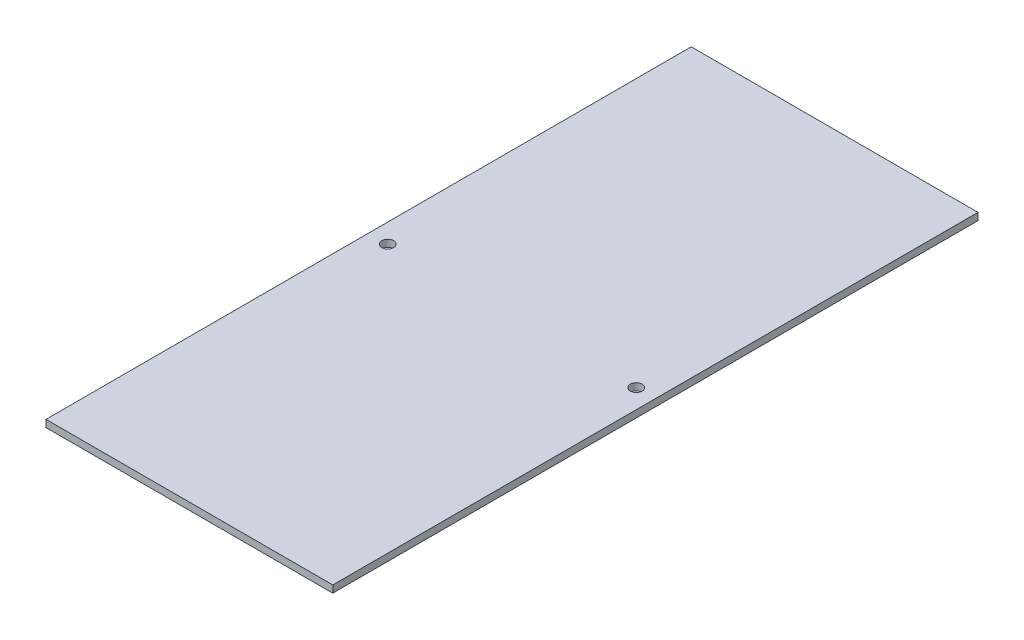
ISO-10303-21;
HEADER;
FILE_DESCRIPTION(('STEP AP214'),'2;1');
FILE_NAME('part.step','',(''),(''),'','','');
FILE_SCHEMA(('AUTOMOTIVE_DESIGN { 1 0 10303 214 1 1 1 1 }'));
ENDSEC;
DATA;
#1=APPLICATION_CONTEXT('core data for automotive mechanical design processes');
#2=APPLICATION_PROTOCOL_DEFINITION('international standard','automotive_design',2000,#1);
#3=PRODUCT_CONTEXT('',#1,'mechanical');
#4=PRODUCT('Part','Part','',(#3));
#5=PRODUCT_RELATED_PRODUCT_CATEGORY('part','',(#4));
#6=PRODUCT_DEFINITION_FORMATION('','',#4);
#7=PRODUCT_DEFINITION_CONTEXT('part definition',#1,'design');
#8=PRODUCT_DEFINITION('design','',#6,#7);
#9=PRODUCT_DEFINITION_SHAPE('','',#8);
#10=(LENGTH_UNIT() NAMED_UNIT(*) SI_UNIT(.MILLI.,.METRE.));
#11=(NAMED_UNIT(*) PLANE_ANGLE_UNIT() SI_UNIT($,.RADIAN.));
#12=(NAMED_UNIT(*) SI_UNIT($,.STERADIAN.) SOLID_ANGLE_UNIT());
#13=UNCERTAINTY_MEASURE_WITH_UNIT(LENGTH_MEASURE(1.E-05),#10,'distance_accuracy_value','');
#14=(GEOMETRIC_REPRESENTATION_CONTEXT(3) GLOBAL_UNCERTAINTY_ASSIGNED_CONTEXT((#13)) GLOBAL_UNIT_ASSIGNED_CONTEXT((#10,
#11,#12)) REPRESENTATION_CONTEXT('',''));
#15=CARTESIAN_POINT('',(0.,0.,0.));
#16=DIRECTION('',(0.,0.,1.));
#17=DIRECTION('',(1.,0.,0.));
#18=AXIS2_PLACEMENT_3D('',#15,#16,#17);
#19=CARTESIAN_POINT('',(60.,-3.,135.));
#20=DIRECTION('',(1.,0.,0.));
#21=DIRECTION('',(0.,0.,-1.));
#22=AXIS2_PLACEMENT_3D('',#19,#20,#21);
#23=PLANE('',#22);
#24=DIRECTION('',(0.,0.,-1.));
#25=VECTOR('',#24,1.);
#26=CARTESIAN_POINT('',(60.,0.,135.));
#27=LINE('',#26,#25);
#28=CARTESIAN_POINT('',(60.,0.,135.));
#29=VERTEX_POINT('',#28);
#30=CARTESIAN_POINT('',(60.,0.,-135.));
#31=VERTEX_POINT('',#30);
#32=EDGE_CURVE('E100',#29,#31,#27,.T.);
#33=ORIENTED_EDGE('',*,*,#32,.F.);
#34=DIRECTION('',(0.,1.,0.));
#35=VECTOR('',#34,1.);
#36=CARTESIAN_POINT('',(60.,-3.,135.));
#37=LINE('',#36,#35);
#38=CARTESIAN_POINT('',(60.,-3.,135.));
#39=VERTEX_POINT('',#38);
#40=EDGE_CURVE('E11',#39,#29,#37,.T.);
#41=ORIENTED_EDGE('',*,*,#40,.F.);
#42=DIRECTION('',(0.,0.,-1.));
#43=VECTOR('',#42,1.);
#44=CARTESIAN_POINT('',(60.,-3.,135.));
#45=LINE('',#44,#43);
#46=CARTESIAN_POINT('',(60.,-3.,-135.));
#47=VERTEX_POINT('',#46);
#48=EDGE_CURVE('E93',#39,#47,#45,.T.);
#49=ORIENTED_EDGE('',*,*,#48,.T.);
#50=DIRECTION('',(0.,1.,0.));
#51=VECTOR('',#50,1.);
#52=CARTESIAN_POINT('',(60.,-3.,-135.));
#53=LINE('',#52,#51);
#54=EDGE_CURVE('E38',#47,#31,#53,.T.);
#55=ORIENTED_EDGE('',*,*,#54,.T.);
#56=EDGE_LOOP('',(#33,#41,#49,#55));
#57=FACE_BOUND('',#56,.T.);
#58=ADVANCED_FACE('F35',(#57),#23,.T.);
#59=CARTESIAN_POINT('',(-60.,-3.,135.));
#60=DIRECTION('',(0.,0.,1.));
#61=DIRECTION('',(1.,0.,0.));
#62=AXIS2_PLACEMENT_3D('',#59,#60,#61);
#63=PLANE('',#62);
#64=DIRECTION('',(1.,0.,0.));
#65=VECTOR('',#64,1.);
#66=CARTESIAN_POINT('',(-60.,0.,135.));
#67=LINE('',#66,#65);
#68=CARTESIAN_POINT('',(-60.,0.,135.));
#69=VERTEX_POINT('',#68);
#70=EDGE_CURVE('E95',#69,#29,#67,.T.);
#71=ORIENTED_EDGE('',*,*,#70,.F.);
#72=DIRECTION('',(0.,1.,0.));
#73=VECTOR('',#72,1.);
#74=CARTESIAN_POINT('',(-60.,-3.,135.));
#75=LINE('',#74,#73);
#76=CARTESIAN_POINT('',(-60.,-3.,135.));
#77=VERTEX_POINT('',#76);
#78=EDGE_CURVE('E44',#77,#69,#75,.T.);
#79=ORIENTED_EDGE('',*,*,#78,.F.);
#80=DIRECTION('',(1.,0.,0.));
#81=VECTOR('',#80,1.);
#82=CARTESIAN_POINT('',(-60.,-3.,135.));
#83=LINE('',#82,#81);
#84=EDGE_CURVE('E90',#77,#39,#83,.T.);
#85=ORIENTED_EDGE('',*,*,#84,.T.);
#86=ORIENTED_EDGE('',*,*,#40,.T.);
#87=EDGE_LOOP('',(#71,#79,#85,#86));
#88=FACE_BOUND('',#87,.T.);
#89=ADVANCED_FACE('F111',(#88),#63,.T.);
#90=CARTESIAN_POINT('',(-60.,-3.,135.));
#91=DIRECTION('',(-1.,0.,0.));
#92=DIRECTION('',(0.,0.,1.));
#93=AXIS2_PLACEMENT_3D('',#90,#91,#92);
#94=PLANE('',#93);
#95=DIRECTION('',(0.,0.,1.));
#96=VECTOR('',#95,1.);
#97=CARTESIAN_POINT('',(-60.,0.,135.));
#98=LINE('',#97,#96);
#99=CARTESIAN_POINT('',(-60.,0.,-135.));
#100=VERTEX_POINT('',#99);
#101=EDGE_CURVE('E85',#100,#69,#98,.T.);
#102=ORIENTED_EDGE('',*,*,#101,.F.);
#103=DIRECTION('',(0.,1.,0.));
#104=VECTOR('',#103,1.);
#105=CARTESIAN_POINT('',(-60.,-3.,-135.));
#106=LINE('',#105,#104);
#107=CARTESIAN_POINT('',(-60.,-3.,-135.));
#108=VERTEX_POINT('',#107);
#109=EDGE_CURVE('E80',#108,#100,#106,.T.);
#110=ORIENTED_EDGE('',*,*,#109,.F.);
#111=DIRECTION('',(0.,0.,1.));
#112=VECTOR('',#111,1.);
#113=CARTESIAN_POINT('',(-60.,-3.,135.));
#114=LINE('',#113,#112);
#115=EDGE_CURVE('E83',#108,#77,#114,.T.);
#116=ORIENTED_EDGE('',*,*,#115,.T.);
#117=ORIENTED_EDGE('',*,*,#78,.T.);
#118=EDGE_LOOP('',(#102,#110,#116,#117));
#119=FACE_BOUND('',#118,.T.);
#120=ADVANCED_FACE('F82',(#119),#94,.T.);
#121=CARTESIAN_POINT('',(-60.,-3.,-135.));
#122=DIRECTION('',(0.,0.,-1.));
#123=DIRECTION('',(-1.,0.,0.));
#124=AXIS2_PLACEMENT_3D('',#121,#122,#123);
#125=PLANE('',#124);
#126=DIRECTION('',(-1.,0.,0.));
#127=VECTOR('',#126,1.);
#128=CARTESIAN_POINT('',(-60.,0.,-135.));
#129=LINE('',#128,#127);
#130=EDGE_CURVE('E103',#31,#100,#129,.T.);
#131=ORIENTED_EDGE('',*,*,#130,.F.);
#132=ORIENTED_EDGE('',*,*,#54,.F.);
#133=DIRECTION('',(-1.,0.,0.));
#134=VECTOR('',#133,1.);
#135=CARTESIAN_POINT('',(-60.,-3.,-135.));
#136=LINE('',#135,#134);
#137=EDGE_CURVE('E89',#47,#108,#136,.T.);
#138=ORIENTED_EDGE('',*,*,#137,.T.);
#139=ORIENTED_EDGE('',*,*,#109,.T.);
#140=EDGE_LOOP('',(#131,#132,#138,#139));
#141=FACE_BOUND('',#140,.T.);
#142=ADVANCED_FACE('F92',(#141),#125,.T.);
#143=CARTESIAN_POINT('',(0.,-3.,0.));
#144=DIRECTION('',(0.,-1.,0.));
#145=DIRECTION('',(0.,0.,-1.));
#146=AXIS2_PLACEMENT_3D('',#143,#144,#145);
#147=PLANE('',#146);
#148=CARTESIAN_POINT('',(52.,-3.,0.));
#149=DIRECTION('',(0.,-1.,0.));
#150=DIRECTION('',(0.,0.,-1.));
#151=AXIS2_PLACEMENT_3D('',#148,#149,#150);
#152=CIRCLE('',#151,2.5);
#153=CARTESIAN_POINT('',(52.,-3.,-2.5));
#154=VERTEX_POINT('',#153);
#155=EDGE_CURVE('E144',#154,#154,#152,.T.);
#156=ORIENTED_EDGE('',*,*,#155,.F.);
#157=EDGE_LOOP('',(#156));
#158=FACE_BOUND('',#157,.T.);
#159=CARTESIAN_POINT('',(-52.,-3.,0.));
#160=DIRECTION('',(0.,-1.,0.));
#161=DIRECTION('',(0.,0.,-1.));
#162=AXIS2_PLACEMENT_3D('',#159,#160,#161);
#163=CIRCLE('',#162,2.5);
#164=CARTESIAN_POINT('',(-52.,-3.,-2.5));
#165=VERTEX_POINT('',#164);
#166=EDGE_CURVE('E104',#165,#165,#163,.T.);
#167=ORIENTED_EDGE('',*,*,#166,.F.);
#168=EDGE_LOOP('',(#167));
#169=FACE_BOUND('',#168,.T.);
#170=ORIENTED_EDGE('',*,*,#48,.F.);
#171=ORIENTED_EDGE('',*,*,#84,.F.);
#172=ORIENTED_EDGE('',*,*,#115,.F.);
#173=ORIENTED_EDGE('',*,*,#137,.F.);
#174=EDGE_LOOP('',(#170,#171,#172,#173));
#175=FACE_BOUND('',#174,.T.);
#176=ADVANCED_FACE('F88',(#158,#169,#175),#147,.T.);
#177=CARTESIAN_POINT('',(0.,0.,0.));
#178=DIRECTION('',(0.,-1.,0.));
#179=DIRECTION('',(0.,0.,-1.));
#180=AXIS2_PLACEMENT_3D('',#177,#178,#179);
#181=PLANE('',#180);
#182=CARTESIAN_POINT('',(52.,0.,0.));
#183=DIRECTION('',(0.,1.,0.));
#184=DIRECTION('',(0.,0.,1.));
#185=AXIS2_PLACEMENT_3D('',#182,#183,#184);
#186=CIRCLE('',#185,2.5);
#187=CARTESIAN_POINT('',(52.,0.,2.5));
#188=VERTEX_POINT('',#187);
#189=EDGE_CURVE('E147',#188,#188,#186,.T.);
#190=ORIENTED_EDGE('',*,*,#189,.F.);
#191=EDGE_LOOP('',(#190));
#192=FACE_BOUND('',#191,.T.);
#193=CARTESIAN_POINT('',(-52.,0.,0.));
#194=DIRECTION('',(0.,1.,0.));
#195=DIRECTION('',(0.,0.,1.));
#196=AXIS2_PLACEMENT_3D('',#193,#194,#195);
#197=CIRCLE('',#196,2.5);
#198=CARTESIAN_POINT('',(-52.,0.,2.5));
#199=VERTEX_POINT('',#198);
#200=EDGE_CURVE('E149',#199,#199,#197,.T.);
#201=ORIENTED_EDGE('',*,*,#200,.F.);
#202=EDGE_LOOP('',(#201));
#203=FACE_BOUND('',#202,.T.);
#204=ORIENTED_EDGE('',*,*,#32,.T.);
#205=ORIENTED_EDGE('',*,*,#130,.T.);
#206=ORIENTED_EDGE('',*,*,#101,.T.);
#207=ORIENTED_EDGE('',*,*,#70,.T.);
#208=EDGE_LOOP('',(#204,#205,#206,#207));
#209=FACE_BOUND('',#208,.T.);
#210=ADVANCED_FACE('F110',(#192,#203,#209),#181,.F.);
#211=CARTESIAN_POINT('',(-52.,-10.,0.));
#212=DIRECTION('',(0.,1.,0.));
#213=DIRECTION('',(0.,0.,1.));
#214=AXIS2_PLACEMENT_3D('',#211,#212,#213);
#215=CYLINDRICAL_SURFACE('',#214,2.5);
#216=ORIENTED_EDGE('',*,*,#166,.T.);
#217=EDGE_LOOP('',(#216));
#218=FACE_BOUND('',#217,.T.);
#219=ORIENTED_EDGE('',*,*,#200,.T.);
#220=EDGE_LOOP('',(#219));
#221=FACE_BOUND('',#220,.T.);
#222=ADVANCED_FACE('F129',(#218,#221),#215,.F.);
#223=CARTESIAN_POINT('',(52.,-10.,0.));
#224=DIRECTION('',(0.,1.,0.));
#225=DIRECTION('',(0.,0.,1.));
#226=AXIS2_PLACEMENT_3D('',#223,#224,#225);
#227=CYLINDRICAL_SURFACE('',#226,2.5);
#228=ORIENTED_EDGE('',*,*,#155,.T.);
#229=EDGE_LOOP('',(#228));
#230=FACE_BOUND('',#229,.T.);
#231=ORIENTED_EDGE('',*,*,#189,.T.);
#232=EDGE_LOOP('',(#231));
#233=FACE_BOUND('',#232,.T.);
#234=ADVANCED_FACE('F136',(#230,#233),#227,.F.);
#235=CLOSED_SHELL('',(#58,#89,#120,#142,#176,#210,#222,#234));
#236=MANIFOLD_SOLID_BREP('B2',#235);
#237=ADVANCED_BREP_SHAPE_REPRESENTATION('',(#18,#236),#14);
#238=SHAPE_DEFINITION_REPRESENTATION(#9,#237);
ENDSEC;
END-ISO-10303-21;
